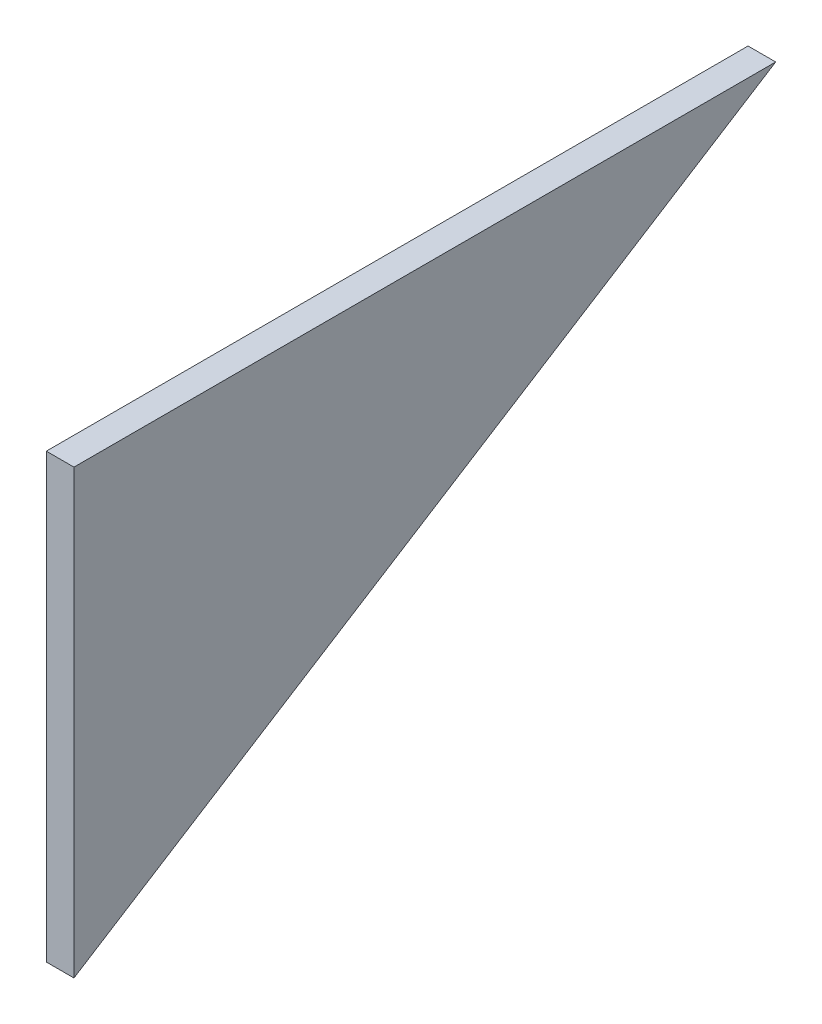
ISO-10303-21;
HEADER;
FILE_DESCRIPTION(('STEP AP214'),'2;1');
FILE_NAME('part.step','',(''),(''),'','','');
FILE_SCHEMA(('AUTOMOTIVE_DESIGN { 1 0 10303 214 1 1 1 1 }'));
ENDSEC;
DATA;
#1=APPLICATION_CONTEXT('core data for automotive mechanical design processes');
#2=APPLICATION_PROTOCOL_DEFINITION('international standard','automotive_design',2000,#1);
#3=PRODUCT_CONTEXT('',#1,'mechanical');
#4=PRODUCT('Part','Part','',(#3));
#5=PRODUCT_RELATED_PRODUCT_CATEGORY('part','',(#4));
#6=PRODUCT_DEFINITION_FORMATION('','',#4);
#7=PRODUCT_DEFINITION_CONTEXT('part definition',#1,'design');
#8=PRODUCT_DEFINITION('design','',#6,#7);
#9=PRODUCT_DEFINITION_SHAPE('','',#8);
#10=(LENGTH_UNIT() NAMED_UNIT(*) SI_UNIT(.MILLI.,.METRE.));
#11=(NAMED_UNIT(*) PLANE_ANGLE_UNIT() SI_UNIT($,.RADIAN.));
#12=(NAMED_UNIT(*) SI_UNIT($,.STERADIAN.) SOLID_ANGLE_UNIT());
#13=UNCERTAINTY_MEASURE_WITH_UNIT(LENGTH_MEASURE(1.E-05),#10,'distance_accuracy_value','');
#14=(GEOMETRIC_REPRESENTATION_CONTEXT(3) GLOBAL_UNCERTAINTY_ASSIGNED_CONTEXT((#13)) GLOBAL_UNIT_ASSIGNED_CONTEXT((#10,
#11,#12)) REPRESENTATION_CONTEXT('',''));
#15=CARTESIAN_POINT('',(0.,0.,0.));
#16=DIRECTION('',(0.,0.,1.));
#17=DIRECTION('',(1.,0.,0.));
#18=AXIS2_PLACEMENT_3D('',#15,#16,#17);
#19=CARTESIAN_POINT('',(3.,28.3353658536585,58.5365853658536));
#20=DIRECTION('',(0.,0.,-1.));
#21=DIRECTION('',(-1.,0.,0.));
#22=AXIS2_PLACEMENT_3D('',#19,#20,#21);
#23=PLANE('',#22);
#24=DIRECTION('',(0.,-1.,0.));
#25=VECTOR('',#24,1.);
#26=CARTESIAN_POINT('',(0.,28.3353658536585,58.5365853658536));
#27=LINE('',#26,#25);
#28=CARTESIAN_POINT('',(0.,28.3353658536585,58.5365853658536));
#29=VERTEX_POINT('',#28);
#30=CARTESIAN_POINT('',(0.,-19.6646341463415,58.5365853658536));
#31=VERTEX_POINT('',#30);
#32=EDGE_CURVE('E80',#29,#31,#27,.T.);
#33=ORIENTED_EDGE('',*,*,#32,.T.);
#34=DIRECTION('',(-1.,0.,0.));
#35=VECTOR('',#34,1.);
#36=CARTESIAN_POINT('',(3.,-19.6646341463415,58.5365853658536));
#37=LINE('',#36,#35);
#38=CARTESIAN_POINT('',(3.,-19.6646341463415,58.5365853658536));
#39=VERTEX_POINT('',#38);
#40=EDGE_CURVE('E11',#39,#31,#37,.T.);
#41=ORIENTED_EDGE('',*,*,#40,.F.);
#42=DIRECTION('',(0.,-1.,0.));
#43=VECTOR('',#42,1.);
#44=CARTESIAN_POINT('',(3.,28.3353658536585,58.5365853658536));
#45=LINE('',#44,#43);
#46=CARTESIAN_POINT('',(3.,28.3353658536585,58.5365853658536));
#47=VERTEX_POINT('',#46);
#48=EDGE_CURVE('E73',#47,#39,#45,.T.);
#49=ORIENTED_EDGE('',*,*,#48,.F.);
#50=DIRECTION('',(-1.,0.,0.));
#51=VECTOR('',#50,1.);
#52=CARTESIAN_POINT('',(3.,28.3353658536585,58.5365853658536));
#53=LINE('',#52,#51);
#54=EDGE_CURVE('E81',#47,#29,#53,.T.);
#55=ORIENTED_EDGE('',*,*,#54,.T.);
#56=EDGE_LOOP('',(#33,#41,#49,#55));
#57=FACE_BOUND('',#56,.T.);
#58=ADVANCED_FACE('F33',(#57),#23,.F.);
#59=CARTESIAN_POINT('',(3.,-19.6646341463415,58.5365853658536));
#60=DIRECTION('',(0.,0.845905169363301,0.533333333333333));
#61=DIRECTION('',(0.,-0.533333333333333,0.845905169363301));
#62=AXIS2_PLACEMENT_3D('',#59,#60,#61);
#63=PLANE('',#62);
#64=DIRECTION('',(0.,0.533333333333333,-0.845905169363301));
#65=VECTOR('',#64,1.);
#66=CARTESIAN_POINT('',(0.,-19.6646341463415,58.5365853658536));
#67=LINE('',#66,#65);
#68=CARTESIAN_POINT('',(0.,28.3353658536585,-17.5948798768435));
#69=VERTEX_POINT('',#68);
#70=EDGE_CURVE('E61',#31,#69,#67,.T.);
#71=ORIENTED_EDGE('',*,*,#70,.T.);
#72=DIRECTION('',(-1.,0.,0.));
#73=VECTOR('',#72,1.);
#74=CARTESIAN_POINT('',(3.,28.3353658536585,-17.5948798768435));
#75=LINE('',#74,#73);
#76=CARTESIAN_POINT('',(3.,28.3353658536585,-17.5948798768435));
#77=VERTEX_POINT('',#76);
#78=EDGE_CURVE('E41',#77,#69,#75,.T.);
#79=ORIENTED_EDGE('',*,*,#78,.F.);
#80=DIRECTION('',(0.,0.533333333333333,-0.845905169363301));
#81=VECTOR('',#80,1.);
#82=CARTESIAN_POINT('',(3.,-19.6646341463415,58.5365853658536));
#83=LINE('',#82,#81);
#84=EDGE_CURVE('E69',#39,#77,#83,.T.);
#85=ORIENTED_EDGE('',*,*,#84,.F.);
#86=ORIENTED_EDGE('',*,*,#40,.T.);
#87=EDGE_LOOP('',(#71,#79,#85,#86));
#88=FACE_BOUND('',#87,.T.);
#89=ADVANCED_FACE('F70',(#88),#63,.F.);
#90=CARTESIAN_POINT('',(3.,28.3353658536585,58.5365853658536));
#91=DIRECTION('',(0.,-1.,0.));
#92=DIRECTION('',(0.,0.,-1.));
#93=AXIS2_PLACEMENT_3D('',#90,#91,#92);
#94=PLANE('',#93);
#95=DIRECTION('',(0.,0.,1.));
#96=VECTOR('',#95,1.);
#97=CARTESIAN_POINT('',(0.,28.3353658536585,58.5365853658536));
#98=LINE('',#97,#96);
#99=EDGE_CURVE('E66',#69,#29,#98,.T.);
#100=ORIENTED_EDGE('',*,*,#99,.T.);
#101=ORIENTED_EDGE('',*,*,#54,.F.);
#102=DIRECTION('',(0.,0.,1.));
#103=VECTOR('',#102,1.);
#104=CARTESIAN_POINT('',(3.,28.3353658536585,58.5365853658536));
#105=LINE('',#104,#103);
#106=EDGE_CURVE('E49',#77,#47,#105,.T.);
#107=ORIENTED_EDGE('',*,*,#106,.F.);
#108=ORIENTED_EDGE('',*,*,#78,.T.);
#109=EDGE_LOOP('',(#100,#101,#107,#108));
#110=FACE_BOUND('',#109,.T.);
#111=ADVANCED_FACE('F88',(#110),#94,.F.);
#112=CARTESIAN_POINT('',(3.,0.,0.));
#113=DIRECTION('',(1.,0.,0.));
#114=DIRECTION('',(0.,0.,-1.));
#115=AXIS2_PLACEMENT_3D('',#112,#113,#114);
#116=PLANE('',#115);
#117=ORIENTED_EDGE('',*,*,#48,.T.);
#118=ORIENTED_EDGE('',*,*,#84,.T.);
#119=ORIENTED_EDGE('',*,*,#106,.T.);
#120=EDGE_LOOP('',(#117,#118,#119));
#121=FACE_BOUND('',#120,.T.);
#122=ADVANCED_FACE('F76',(#121),#116,.T.);
#123=CARTESIAN_POINT('',(0.,0.,0.));
#124=DIRECTION('',(1.,0.,0.));
#125=DIRECTION('',(0.,0.,-1.));
#126=AXIS2_PLACEMENT_3D('',#123,#124,#125);
#127=PLANE('',#126);
#128=ORIENTED_EDGE('',*,*,#32,.F.);
#129=ORIENTED_EDGE('',*,*,#99,.F.);
#130=ORIENTED_EDGE('',*,*,#70,.F.);
#131=EDGE_LOOP('',(#128,#129,#130));
#132=FACE_BOUND('',#131,.T.);
#133=ADVANCED_FACE('F89',(#132),#127,.F.);
#134=CLOSED_SHELL('',(#58,#89,#111,#122,#133));
#135=MANIFOLD_SOLID_BREP('B2',#134);
#136=ADVANCED_BREP_SHAPE_REPRESENTATION('',(#18,#135),#14);
#137=SHAPE_DEFINITION_REPRESENTATION(#9,#136);
ENDSEC;
END-ISO-10303-21;
